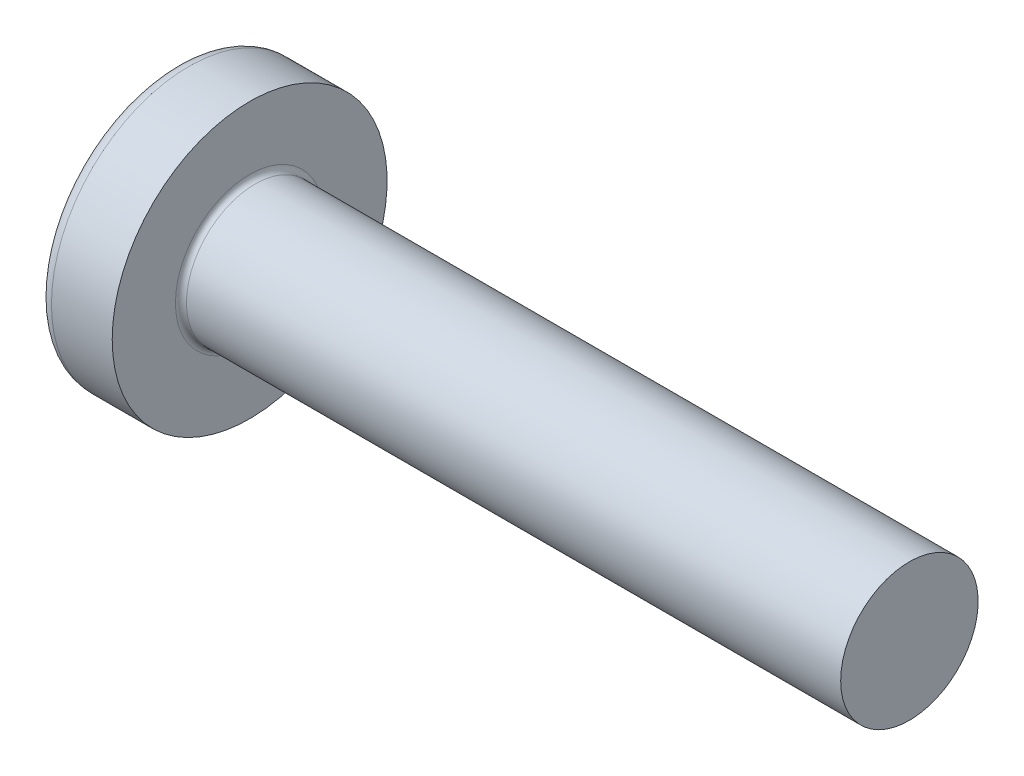
ISO-10303-21;
HEADER;
FILE_DESCRIPTION(('STEP AP214'),'2;1');
FILE_NAME('part.step','',(''),(''),'','','');
FILE_SCHEMA(('AUTOMOTIVE_DESIGN { 1 0 10303 214 1 1 1 1 }'));
ENDSEC;
DATA;
#1=APPLICATION_CONTEXT('core data for automotive mechanical design processes');
#2=APPLICATION_PROTOCOL_DEFINITION('international standard','automotive_design',2000,#1);
#3=PRODUCT_CONTEXT('',#1,'mechanical');
#4=PRODUCT('Part','Part','',(#3));
#5=PRODUCT_RELATED_PRODUCT_CATEGORY('part','',(#4));
#6=PRODUCT_DEFINITION_FORMATION('','',#4);
#7=PRODUCT_DEFINITION_CONTEXT('part definition',#1,'design');
#8=PRODUCT_DEFINITION('design','',#6,#7);
#9=PRODUCT_DEFINITION_SHAPE('','',#8);
#10=(LENGTH_UNIT() NAMED_UNIT(*) SI_UNIT(.MILLI.,.METRE.));
#11=(NAMED_UNIT(*) PLANE_ANGLE_UNIT() SI_UNIT($,.RADIAN.));
#12=(NAMED_UNIT(*) SI_UNIT($,.STERADIAN.) SOLID_ANGLE_UNIT());
#13=UNCERTAINTY_MEASURE_WITH_UNIT(LENGTH_MEASURE(1.E-05),#10,'distance_accuracy_value','');
#14=(GEOMETRIC_REPRESENTATION_CONTEXT(3) GLOBAL_UNCERTAINTY_ASSIGNED_CONTEXT((#13)) GLOBAL_UNIT_ASSIGNED_CONTEXT((#10,
#11,#12)) REPRESENTATION_CONTEXT('',''));
#15=CARTESIAN_POINT('',(0.,0.,0.));
#16=DIRECTION('',(0.,0.,1.));
#17=DIRECTION('',(1.,0.,0.));
#18=AXIS2_PLACEMENT_3D('',#15,#16,#17);
#19=CARTESIAN_POINT('',(4.,0.,0.));
#20=DIRECTION('',(-1.,0.,0.));
#21=DIRECTION('',(0.,1.,0.));
#22=AXIS2_PLACEMENT_3D('',#19,#20,#21);
#23=SPHERICAL_SURFACE('',#22,4.);
#24=CARTESIAN_POINT('',(0.803195914613461,0.,0.));
#25=DIRECTION('',(-1.,0.,0.));
#26=DIRECTION('',(0.,0.,1.));
#27=AXIS2_PLACEMENT_3D('',#24,#25,#26);
#28=CIRCLE('',#27,2.40425531914894);
#29=CARTESIAN_POINT('',(0.803195914613461,0.,2.40425531914889));
#30=VERTEX_POINT('',#29);
#31=EDGE_CURVE('E238',#30,#30,#28,.T.);
#32=ORIENTED_EDGE('',*,*,#31,.T.);
#33=EDGE_LOOP('',(#32));
#34=FACE_BOUND('',#33,.T.);
#35=CARTESIAN_POINT('',(0.0543400780062958,0.,0.));
#36=DIRECTION('',(1.,0.,0.));
#37=DIRECTION('',(0.,0.,-1.));
#38=AXIS2_PLACEMENT_3D('',#35,#36,#37);
#39=CIRCLE('',#38,0.657090389499513);
#40=CARTESIAN_POINT('',(0.0543400780062958,-0.369999999999954,-0.543017292517121));
#41=VERTEX_POINT('',#40);
#42=CARTESIAN_POINT('',(0.0543400780062958,-0.543017292517115,-0.370000000000002));
#43=VERTEX_POINT('',#42);
#44=EDGE_CURVE('E374',#41,#43,#39,.F.);
#45=ORIENTED_EDGE('',*,*,#44,.F.);
#46=CARTESIAN_POINT('',(4.,-0.370000000000023,0.));
#47=DIRECTION('',(0.,1.,0.));
#48=DIRECTION('',(0.,0.,1.));
#49=AXIS2_PLACEMENT_3D('',#46,#47,#48);
#50=CIRCLE('',#49,3.98285073785097);
#51=CARTESIAN_POINT('',(0.201999107564771,-0.369999999999995,-1.19928696360011));
#52=VERTEX_POINT('',#51);
#53=EDGE_CURVE('E300',#52,#41,#50,.T.);
#54=ORIENTED_EDGE('',*,*,#53,.F.);
#55=CARTESIAN_POINT('',(3.72274316107109,0.,0.556091207572086));
#56=DIRECTION('',(0.446197800778958,0.,-0.894934367749961));
#57=DIRECTION('',(-0.89493436774996,0.,-0.446197800778958));
#58=AXIS2_PLACEMENT_3D('',#55,#56,#57);
#59=CIRCLE('',#58,3.95144166275147);
#60=CARTESIAN_POINT('',(0.201999107564771,0.370000000000002,-1.19928696360015));
#61=VERTEX_POINT('',#60);
#62=EDGE_CURVE('E272',#52,#61,#59,.T.);
#63=ORIENTED_EDGE('',*,*,#62,.T.);
#64=CARTESIAN_POINT('',(4.,0.369999999999981,0.));
#65=DIRECTION('',(0.,-1.,0.));
#66=DIRECTION('',(0.,0.,-1.));
#67=AXIS2_PLACEMENT_3D('',#64,#65,#66);
#68=CIRCLE('',#67,3.98285073785097);
#69=CARTESIAN_POINT('',(0.0543400780062958,0.370000000000044,-0.543017292517156));
#70=VERTEX_POINT('',#69);
#71=EDGE_CURVE('E327',#70,#61,#68,.T.);
#72=ORIENTED_EDGE('',*,*,#71,.F.);
#73=CARTESIAN_POINT('',(0.0543400780062958,0.543017292517115,-0.370000000000044));
#74=VERTEX_POINT('',#73);
#75=EDGE_CURVE('E393',#74,#70,#39,.F.);
#76=ORIENTED_EDGE('',*,*,#75,.F.);
#77=CARTESIAN_POINT('',(4.,0.,-0.370000000000044));
#78=DIRECTION('',(0.,0.,1.));
#79=DIRECTION('',(1.,0.,0.));
#80=AXIS2_PLACEMENT_3D('',#77,#78,#79);
#81=CIRCLE('',#80,3.98285073785097);
#82=CARTESIAN_POINT('',(0.201999107564771,1.19928696360011,-0.370000000000002));
#83=VERTEX_POINT('',#82);
#84=EDGE_CURVE('E266',#83,#74,#81,.T.);
#85=ORIENTED_EDGE('',*,*,#84,.F.);
#86=CARTESIAN_POINT('',(3.72274316107109,-0.556091207572149,0.));
#87=DIRECTION('',(0.446197800778958,0.89493436774996,0.));
#88=DIRECTION('',(-0.89493436774996,0.446197800778958,0.));
#89=AXIS2_PLACEMENT_3D('',#86,#87,#88);
#90=CIRCLE('',#89,3.95144166275147);
#91=CARTESIAN_POINT('',(0.201999107564771,1.19928696360013,0.370000000000002));
#92=VERTEX_POINT('',#91);
#93=EDGE_CURVE('E269',#83,#92,#90,.T.);
#94=ORIENTED_EDGE('',*,*,#93,.T.);
#95=CARTESIAN_POINT('',(4.,0.,0.369999999999961));
#96=DIRECTION('',(0.,0.,-1.));
#97=DIRECTION('',(0.,1.,0.));
#98=AXIS2_PLACEMENT_3D('',#95,#96,#97);
#99=CIRCLE('',#98,3.98285073785097);
#100=CARTESIAN_POINT('',(0.0543400780062958,0.543017292517135,0.369999999999961));
#101=VERTEX_POINT('',#100);
#102=EDGE_CURVE('E262',#101,#92,#99,.T.);
#103=ORIENTED_EDGE('',*,*,#102,.F.);
#104=CARTESIAN_POINT('',(0.0543400780062958,0.369999999999995,0.54301729251708));
#105=VERTEX_POINT('',#104);
#106=EDGE_CURVE('E392',#105,#101,#39,.F.);
#107=ORIENTED_EDGE('',*,*,#106,.F.);
#108=CARTESIAN_POINT('',(0.201999107564771,0.370000000000016,1.19928696360008));
#109=VERTEX_POINT('',#108);
#110=EDGE_CURVE('E282',#109,#105,#68,.T.);
#111=ORIENTED_EDGE('',*,*,#110,.F.);
#112=CARTESIAN_POINT('',(3.72274316107109,0.,-0.556091207572169));
#113=DIRECTION('',(0.446197800778958,0.,0.89493436774996));
#114=DIRECTION('',(0.89493436774996,0.,-0.446197800778958));
#115=AXIS2_PLACEMENT_3D('',#112,#113,#114);
#116=CIRCLE('',#115,3.95144166275147);
#117=CARTESIAN_POINT('',(0.201999107564771,-0.369999999999981,1.19928696360011));
#118=VERTEX_POINT('',#117);
#119=EDGE_CURVE('E49',#109,#118,#116,.T.);
#120=ORIENTED_EDGE('',*,*,#119,.T.);
#121=CARTESIAN_POINT('',(0.0543400780062958,-0.370000000000002,0.543017292517115));
#122=VERTEX_POINT('',#121);
#123=EDGE_CURVE('E279',#122,#118,#50,.T.);
#124=ORIENTED_EDGE('',*,*,#123,.F.);
#125=CARTESIAN_POINT('',(0.0543400780062958,-0.543017292517094,0.370000000000002));
#126=VERTEX_POINT('',#125);
#127=EDGE_CURVE('E428',#126,#122,#39,.F.);
#128=ORIENTED_EDGE('',*,*,#127,.F.);
#129=CARTESIAN_POINT('',(0.201999107564771,-1.19928696360007,0.369999999999961));
#130=VERTEX_POINT('',#129);
#131=EDGE_CURVE('E263',#130,#126,#99,.T.);
#132=ORIENTED_EDGE('',*,*,#131,.F.);
#133=CARTESIAN_POINT('',(3.72274316107109,0.556091207572107,0.));
#134=DIRECTION('',(0.446197800778958,-0.894934367749961,0.));
#135=DIRECTION('',(0.89493436774996,0.446197800778958,0.));
#136=AXIS2_PLACEMENT_3D('',#133,#134,#135);
#137=CIRCLE('',#136,3.95144166275147);
#138=CARTESIAN_POINT('',(0.201999107564771,-1.19928696360011,-0.370000000000044));
#139=VERTEX_POINT('',#138);
#140=EDGE_CURVE('E259',#130,#139,#137,.T.);
#141=ORIENTED_EDGE('',*,*,#140,.T.);
#142=EDGE_CURVE('E64',#43,#139,#81,.T.);
#143=ORIENTED_EDGE('',*,*,#142,.F.);
#144=EDGE_LOOP('',(#45,#54,#63,#72,#76,#85,#94,#103,#107,#111,#120,#124,#128,#132,#141,#143));
#145=FACE_BOUND('',#144,.T.);
#146=ADVANCED_FACE('F36',(#34,#145),#23,.T.);
#147=CARTESIAN_POINT('',(1.5,0.552127613725223,-0.370000000000044));
#148=DIRECTION('',(0.,0.,1.));
#149=DIRECTION('',(1.,0.,0.));
#150=AXIS2_PLACEMENT_3D('',#147,#148,#149);
#151=PLANE('',#150);
#152=ORIENTED_EDGE('',*,*,#84,.T.);
#153=CARTESIAN_POINT('',(-0.984107487668667,0.628943903399945,-0.370000000000044));
#154=CARTESIAN_POINT('',(-0.783603343008974,0.612669947295709,-0.370000000000044));
#155=CARTESIAN_POINT('',(-0.583110931104087,0.596248129681112,-0.370000000000044));
#156=CARTESIAN_POINT('',(-0.18215578845211,0.562989164841699,-0.370000000000044));
#157=CARTESIAN_POINT('',(0.0183069414735524,0.546152007726028,-0.370000000000044));
#158=CARTESIAN_POINT('',(0.419186928470487,0.511943523152248,-0.370000000000044));
#159=CARTESIAN_POINT('',(0.61960418554543,0.494572195737289,-0.370000000000044));
#160=CARTESIAN_POINT('',(1.02037173794706,0.459102589125867,-0.370000000000044));
#161=CARTESIAN_POINT('',(1.22072203423871,0.441004320904914,-0.370000000000044));
#162=CARTESIAN_POINT('',(1.53631168775259,0.411665443099231,-0.370000000000044));
#163=CARTESIAN_POINT('',(1.65158348734209,0.400774467003812,-0.370000000000044));
#164=CARTESIAN_POINT('',(1.88208360561816,0.378547148307999,-0.370000000000044));
#165=CARTESIAN_POINT('',(1.99731192452822,0.367210808029304,-0.370000000000044));
#166=CARTESIAN_POINT('',(2.22771614129237,0.343963614894699,-0.370000000000044));
#167=CARTESIAN_POINT('',(2.34289203669079,0.332052737461366,-0.370000000000044));
#168=CARTESIAN_POINT('',(2.5731581934851,0.30741320876735,-0.370000000000044));
#169=CARTESIAN_POINT('',(2.68824845325022,0.294684542317189,-0.370000000000044));
#170=CARTESIAN_POINT('',(2.80327961663798,0.281425340988552,-0.370000000000044));
#171=B_SPLINE_CURVE_WITH_KNOTS('',3,(#153,#154,#155,#156,#157,#158,#159,#160,#161,#162,#163,
#164,#165,#166,#167,#168,#169,#170),.UNSPECIFIED.,.F.,.F.,(4,2,2,2,2,2,2,2,4),(0.,
0.603490856265066,1.20699609790343,1.81050129079257,2.41399737525255,2.7613521432415,
3.1087051006963,3.45607293033825,3.80344721379854),.UNSPECIFIED.);
#172=CARTESIAN_POINT('',(1.5,0.415013252800397,-0.370000000000044));
#173=VERTEX_POINT('',#172);
#174=EDGE_CURVE('E414',#74,#173,#171,.T.);
#175=ORIENTED_EDGE('',*,*,#174,.T.);
#176=DIRECTION('',(0.,1.,0.));
#177=VECTOR('',#176,1.);
#178=CARTESIAN_POINT('',(1.5,-0.552127613725306,-0.370000000000002));
#179=LINE('',#178,#177);
#180=CARTESIAN_POINT('',(1.5,0.552127613725223,-0.370000000000044));
#181=VERTEX_POINT('',#180);
#182=EDGE_CURVE('E356',#173,#181,#179,.T.);
#183=ORIENTED_EDGE('',*,*,#182,.T.);
#184=DIRECTION('',(0.89493436774996,-0.446197800778958,0.));
#185=VECTOR('',#184,1.);
#186=CARTESIAN_POINT('',(0.,1.3,-0.370000000000002));
#187=LINE('',#186,#185);
#188=EDGE_CURVE('E239',#83,#181,#187,.T.);
#189=ORIENTED_EDGE('',*,*,#188,.F.);
#190=EDGE_LOOP('',(#152,#175,#183,#189));
#191=FACE_BOUND('',#190,.T.);
#192=ADVANCED_FACE('F194',(#191),#151,.T.);
#193=CARTESIAN_POINT('',(1.5,-0.552127613725306,-0.370000000000002));
#194=VERTEX_POINT('',#193);
#195=CARTESIAN_POINT('',(1.5,-0.415013252800481,-0.370000000000002));
#196=VERTEX_POINT('',#195);
#197=EDGE_CURVE('E247',#194,#196,#179,.T.);
#198=ORIENTED_EDGE('',*,*,#197,.T.);
#199=CARTESIAN_POINT('',(-0.984107487668667,-0.628943903399945,-0.370000000000002));
#200=CARTESIAN_POINT('',(-0.78360334300897,-0.612669947295761,-0.370000000000063));
#201=CARTESIAN_POINT('',(-0.583110931104083,-0.596248129681166,-0.37000000000006));
#202=CARTESIAN_POINT('',(-0.182155788452108,-0.562989164841729,-0.370000000000027));
#203=CARTESIAN_POINT('',(0.0183069414735527,-0.546152007726031,-0.369999999999997));
#204=CARTESIAN_POINT('',(0.419186928470485,-0.511943523152245,-0.370000000000007));
#205=CARTESIAN_POINT('',(0.619604185545429,-0.494572195737305,-0.370000000000048));
#206=CARTESIAN_POINT('',(1.02037173794706,-0.459102589125934,-0.37000000000004));
#207=CARTESIAN_POINT('',(1.22072203423871,-0.441004320905012,-0.369999999999991));
#208=CARTESIAN_POINT('',(1.53631168775259,-0.411665443099305,-0.370000000000009));
#209=CARTESIAN_POINT('',(1.65158348734209,-0.400774467003864,-0.370000000000035));
#210=CARTESIAN_POINT('',(1.88208360561815,-0.378547148308031,-0.370000000000053));
#211=CARTESIAN_POINT('',(1.99731192452822,-0.367210808029342,-0.370000000000046));
#212=CARTESIAN_POINT('',(2.22771614129238,-0.343963614894743,-0.370000000000042));
#213=CARTESIAN_POINT('',(2.34289203669079,-0.332052737461413,-0.370000000000047));
#214=CARTESIAN_POINT('',(2.5731581934851,-0.307413208767386,-0.370000000000041));
#215=CARTESIAN_POINT('',(2.68824845325022,-0.294684542317213,-0.370000000000032));
#216=CARTESIAN_POINT('',(2.80327961663798,-0.281425340988552,-0.370000000000002));
#217=B_SPLINE_CURVE_WITH_KNOTS('',3,(#199,#200,#201,#202,#203,#204,#205,#206,#207,#208,#209,
#210,#211,#212,#213,#214,#215,#216),.UNSPECIFIED.,.F.,.F.,(4,2,2,2,2,2,2,2,4),(0.,
0.603490856265066,1.20699609790343,1.81050129079257,2.41399737525255,2.7613521432415,
3.1087051006963,3.45607293033825,3.80344721379854),.UNSPECIFIED.);
#218=EDGE_CURVE('E391',#196,#43,#217,.F.);
#219=ORIENTED_EDGE('',*,*,#218,.T.);
#220=ORIENTED_EDGE('',*,*,#142,.T.);
#221=DIRECTION('',(0.89493436774996,0.446197800778958,0.));
#222=VECTOR('',#221,1.);
#223=CARTESIAN_POINT('',(0.,-1.3,-0.370000000000044));
#224=LINE('',#223,#222);
#225=EDGE_CURVE('E330',#139,#194,#224,.T.);
#226=ORIENTED_EDGE('',*,*,#225,.T.);
#227=EDGE_LOOP('',(#198,#219,#220,#226));
#228=FACE_BOUND('',#227,.T.);
#229=ADVANCED_FACE('F200',(#228),#151,.T.);
#230=CARTESIAN_POINT('',(1.5,-0.552127613725285,0.370000000000002));
#231=DIRECTION('',(0.,0.,-1.));
#232=DIRECTION('',(0.,1.,0.));
#233=AXIS2_PLACEMENT_3D('',#230,#231,#232);
#234=PLANE('',#233);
#235=DIRECTION('',(0.,-1.,0.));
#236=VECTOR('',#235,1.);
#237=CARTESIAN_POINT('',(1.5,0.552127613725244,0.369999999999961));
#238=LINE('',#237,#236);
#239=CARTESIAN_POINT('',(1.5,0.552127613725244,0.369999999999961));
#240=VERTEX_POINT('',#239);
#241=CARTESIAN_POINT('',(1.5,0.415013252800418,0.369999999999961));
#242=VERTEX_POINT('',#241);
#243=EDGE_CURVE('E339',#240,#242,#238,.T.);
#244=ORIENTED_EDGE('',*,*,#243,.T.);
#245=CARTESIAN_POINT('',(-0.984107487668667,0.628943903399966,0.369999999999961));
#246=CARTESIAN_POINT('',(-0.78360334300898,0.612669947295659,0.370000000000021));
#247=CARTESIAN_POINT('',(-0.583110931104093,0.596248129681067,0.370000000000019));
#248=CARTESIAN_POINT('',(-0.182155788452112,0.562989164841693,0.369999999999986));
#249=CARTESIAN_POINT('',(0.0183069414735532,0.546152007726057,0.369999999999955));
#250=CARTESIAN_POINT('',(0.419186928470486,0.511943523152261,0.369999999999966));
#251=CARTESIAN_POINT('',(0.619604185545425,0.49457219573725,0.370000000000006));
#252=CARTESIAN_POINT('',(1.02037173794705,0.459102589125841,0.369999999999998));
#253=CARTESIAN_POINT('',(1.22072203423871,0.441004320904952,0.36999999999995));
#254=CARTESIAN_POINT('',(1.53631168775259,0.411665443099242,0.369999999999967));
#255=CARTESIAN_POINT('',(1.65158348734209,0.400774467003787,0.369999999999993));
#256=CARTESIAN_POINT('',(1.88208360561815,0.378547148307946,0.370000000000012));
#257=CARTESIAN_POINT('',(1.99731192452821,0.36721080802926,0.370000000000004));
#258=CARTESIAN_POINT('',(2.22771614129237,0.343963614894657,0.370000000000001));
#259=CARTESIAN_POINT('',(2.34289203669078,0.332052737461319,0.370000000000005));
#260=CARTESIAN_POINT('',(2.57315819348509,0.307413208767301,0.37));
#261=CARTESIAN_POINT('',(2.68824845325022,0.294684542317145,0.36999999999999));
#262=CARTESIAN_POINT('',(2.80327961663798,0.281425340988531,0.369999999999961));
#263=B_SPLINE_CURVE_WITH_KNOTS('',3,(#245,#246,#247,#248,#249,#250,#251,#252,#253,#254,#255,
#256,#257,#258,#259,#260,#261,#262),.UNSPECIFIED.,.F.,.F.,(4,2,2,2,2,2,2,2,4),(0.,
0.603490856265066,1.20699609790343,1.81050129079257,2.41399737525255,2.7613521432415,
3.1087051006963,3.45607293033825,3.80344721379854),.UNSPECIFIED.);
#264=EDGE_CURVE('E612',#242,#101,#263,.F.);
#265=ORIENTED_EDGE('',*,*,#264,.T.);
#266=ORIENTED_EDGE('',*,*,#102,.T.);
#267=DIRECTION('',(0.89493436774996,-0.446197800778958,0.));
#268=VECTOR('',#267,1.);
#269=CARTESIAN_POINT('',(0.,1.30000000000002,0.370000000000002));
#270=LINE('',#269,#268);
#271=EDGE_CURVE('E244',#92,#240,#270,.T.);
#272=ORIENTED_EDGE('',*,*,#271,.T.);
#273=EDGE_LOOP('',(#244,#265,#266,#272));
#274=FACE_BOUND('',#273,.T.);
#275=ADVANCED_FACE('F410',(#274),#234,.T.);
#276=ORIENTED_EDGE('',*,*,#131,.T.);
#277=CARTESIAN_POINT('',(-0.984107487668667,-0.628943903399924,0.370000000000002));
#278=CARTESIAN_POINT('',(-0.783603343008972,-0.61266994729573,0.370000000000002));
#279=CARTESIAN_POINT('',(-0.583110931104084,-0.596248129681136,0.370000000000002));
#280=CARTESIAN_POINT('',(-0.182155788452108,-0.562989164841705,0.370000000000002));
#281=CARTESIAN_POINT('',(0.018306941473553,-0.546152007726013,0.370000000000002));
#282=CARTESIAN_POINT('',(0.419186928470485,-0.511943523152221,0.370000000000002));
#283=CARTESIAN_POINT('',(0.619604185545428,-0.49457219573727,0.370000000000002));
#284=CARTESIAN_POINT('',(1.02037173794706,-0.459102589125904,0.370000000000002));
#285=CARTESIAN_POINT('',(1.22072203423871,-0.441004320904998,0.370000000000002));
#286=CARTESIAN_POINT('',(1.53631168775259,-0.411665443099281,0.370000000000002));
#287=CARTESIAN_POINT('',(1.65158348734209,-0.400774467003828,0.370000000000002));
#288=CARTESIAN_POINT('',(1.88208360561815,-0.378547148307988,0.370000000000002));
#289=CARTESIAN_POINT('',(1.99731192452821,-0.367210808029302,0.370000000000002));
#290=CARTESIAN_POINT('',(2.22771614129237,-0.343963614894698,0.370000000000002));
#291=CARTESIAN_POINT('',(2.34289203669078,-0.33205273746136,0.370000000000002));
#292=CARTESIAN_POINT('',(2.57315819348509,-0.307413208767343,0.370000000000002));
#293=CARTESIAN_POINT('',(2.68824845325022,-0.294684542317187,0.370000000000002));
#294=CARTESIAN_POINT('',(2.80327961663798,-0.281425340988573,0.370000000000002));
#295=B_SPLINE_CURVE_WITH_KNOTS('',3,(#277,#278,#279,#280,#281,#282,#283,#284,#285,#286,#287,
#288,#289,#290,#291,#292,#293,#294),.UNSPECIFIED.,.F.,.F.,(4,2,2,2,2,2,2,2,4),(0.,
0.603490856265066,1.20699609790343,1.81050129079257,2.41399737525255,2.7613521432415,
3.10870510069629,3.45607293033825,3.80344721379854),.UNSPECIFIED.);
#296=CARTESIAN_POINT('',(1.5,-0.41501325280046,0.370000000000002));
#297=VERTEX_POINT('',#296);
#298=EDGE_CURVE('E429',#126,#297,#295,.T.);
#299=ORIENTED_EDGE('',*,*,#298,.T.);
#300=CARTESIAN_POINT('',(1.5,-0.552127613725285,0.370000000000002));
#301=VERTEX_POINT('',#300);
#302=EDGE_CURVE('E341',#297,#301,#238,.T.);
#303=ORIENTED_EDGE('',*,*,#302,.T.);
#304=DIRECTION('',(0.89493436774996,0.446197800778958,0.));
#305=VECTOR('',#304,1.);
#306=CARTESIAN_POINT('',(0.,-1.29999999999996,0.369999999999961));
#307=LINE('',#306,#305);
#308=EDGE_CURVE('E332',#130,#301,#307,.T.);
#309=ORIENTED_EDGE('',*,*,#308,.F.);
#310=EDGE_LOOP('',(#276,#299,#303,#309));
#311=FACE_BOUND('',#310,.T.);
#312=ADVANCED_FACE('F528',(#311),#234,.T.);
#313=CARTESIAN_POINT('',(1.5,0.552127613725244,0.369999999999961));
#314=DIRECTION('',(0.446197800778958,0.89493436774996,0.));
#315=DIRECTION('',(-0.89493436774996,0.446197800778958,0.));
#316=AXIS2_PLACEMENT_3D('',#313,#314,#315);
#317=PLANE('',#316);
#318=CARTESIAN_POINT('',(2.47007520981164,0.068465972373373,0.));
#319=DIRECTION('',(0.446197800778958,0.89493436774996,0.));
#320=DIRECTION('',(-0.89493436774996,0.446197800778958,0.));
#321=AXIS2_PLACEMENT_3D('',#318,#319,#320);
#322=ELLIPSE('',#321,1.09405678911959,0.483340660124242);
#323=CARTESIAN_POINT('',(1.5,0.552127613725244,0.0655064741994296));
#324=VERTEX_POINT('',#323);
#325=CARTESIAN_POINT('',(1.5,0.552127613725244,-0.0655064741995129));
#326=VERTEX_POINT('',#325);
#327=EDGE_CURVE('E305',#324,#326,#322,.F.);
#328=ORIENTED_EDGE('',*,*,#327,.F.);
#329=DIRECTION('',(0.,0.,-1.));
#330=VECTOR('',#329,1.);
#331=CARTESIAN_POINT('',(1.5,0.552127613725244,0.369999999999961));
#332=LINE('',#331,#330);
#333=EDGE_CURVE('E342',#240,#324,#332,.T.);
#334=ORIENTED_EDGE('',*,*,#333,.F.);
#335=ORIENTED_EDGE('',*,*,#271,.F.);
#336=ORIENTED_EDGE('',*,*,#93,.F.);
#337=ORIENTED_EDGE('',*,*,#188,.T.);
#338=EDGE_CURVE('E344',#326,#181,#332,.T.);
#339=ORIENTED_EDGE('',*,*,#338,.F.);
#340=EDGE_LOOP('',(#328,#334,#335,#336,#337,#339));
#341=FACE_BOUND('',#340,.T.);
#342=ADVANCED_FACE('F408',(#341),#317,.F.);
#343=CARTESIAN_POINT('',(0.,-1.3,-0.370000000000044));
#344=DIRECTION('',(0.446197800778958,-0.894934367749961,0.));
#345=DIRECTION('',(0.89493436774996,0.446197800778958,0.));
#346=AXIS2_PLACEMENT_3D('',#343,#344,#345);
#347=PLANE('',#346);
#348=CARTESIAN_POINT('',(2.47007520981164,-0.0684659723734146,0.));
#349=DIRECTION('',(0.446197800778958,-0.894934367749961,0.));
#350=DIRECTION('',(-0.89493436774996,-0.446197800778958,0.));
#351=AXIS2_PLACEMENT_3D('',#348,#349,#350);
#352=ELLIPSE('',#351,1.09405678911959,0.483340660124243);
#353=CARTESIAN_POINT('',(1.5,-0.552127613725285,-0.0655064741994713));
#354=VERTEX_POINT('',#353);
#355=CARTESIAN_POINT('',(1.5,-0.552127613725285,0.0655064741994713));
#356=VERTEX_POINT('',#355);
#357=EDGE_CURVE('E614',#354,#356,#352,.F.);
#358=ORIENTED_EDGE('',*,*,#357,.F.);
#359=DIRECTION('',(0.,0.,1.));
#360=VECTOR('',#359,1.);
#361=CARTESIAN_POINT('',(1.5,-0.552127613725306,-0.370000000000002));
#362=LINE('',#361,#360);
#363=EDGE_CURVE('E335',#194,#354,#362,.T.);
#364=ORIENTED_EDGE('',*,*,#363,.F.);
#365=ORIENTED_EDGE('',*,*,#225,.F.);
#366=ORIENTED_EDGE('',*,*,#140,.F.);
#367=ORIENTED_EDGE('',*,*,#308,.T.);
#368=EDGE_CURVE('E338',#356,#301,#362,.T.);
#369=ORIENTED_EDGE('',*,*,#368,.F.);
#370=EDGE_LOOP('',(#358,#364,#365,#366,#367,#369));
#371=FACE_BOUND('',#370,.T.);
#372=ADVANCED_FACE('F515',(#371),#347,.F.);
#373=CARTESIAN_POINT('',(1.5,0.552127613725223,-0.370000000000044));
#374=DIRECTION('',(-1.,0.,0.));
#375=DIRECTION('',(0.,0.,1.));
#376=AXIS2_PLACEMENT_3D('',#373,#374,#375);
#377=PLANE('',#376);
#378=DIRECTION('',(0.,1.,0.));
#379=VECTOR('',#378,1.);
#380=CARTESIAN_POINT('',(1.5,-0.370000000000002,0.552127613725258));
#381=LINE('',#380,#379);
#382=CARTESIAN_POINT('',(1.5,-0.370000000000002,0.552127613725258));
#383=VERTEX_POINT('',#382);
#384=CARTESIAN_POINT('',(1.5,-0.0655064741994851,0.552127613725223));
#385=VERTEX_POINT('',#384);
#386=EDGE_CURVE('E320',#383,#385,#381,.T.);
#387=ORIENTED_EDGE('',*,*,#386,.T.);
#388=CARTESIAN_POINT('',(1.5,0.,0.));
#389=DIRECTION('',(-1.,0.,0.));
#390=DIRECTION('',(0.,0.,1.));
#391=AXIS2_PLACEMENT_3D('',#388,#389,#390);
#392=CIRCLE('',#391,0.556);
#393=CARTESIAN_POINT('',(1.5,-0.370000000000023,0.415013252800439));
#394=VERTEX_POINT('',#393);
#395=EDGE_CURVE('E640',#394,#385,#392,.T.);
#396=ORIENTED_EDGE('',*,*,#395,.F.);
#397=DIRECTION('',(0.,0.,-1.));
#398=VECTOR('',#397,1.);
#399=CARTESIAN_POINT('',(1.5,-0.370000000000002,0.552127613725258));
#400=LINE('',#399,#398);
#401=EDGE_CURVE('E316',#383,#394,#400,.T.);
#402=ORIENTED_EDGE('',*,*,#401,.F.);
#403=EDGE_LOOP('',(#387,#396,#402));
#404=FACE_BOUND('',#403,.T.);
#405=ADVANCED_FACE('F465',(#404),#377,.T.);
#406=ORIENTED_EDGE('',*,*,#302,.F.);
#407=EDGE_CURVE('E645',#356,#297,#392,.T.);
#408=ORIENTED_EDGE('',*,*,#407,.F.);
#409=ORIENTED_EDGE('',*,*,#368,.T.);
#410=EDGE_LOOP('',(#406,#408,#409));
#411=FACE_BOUND('',#410,.T.);
#412=ADVANCED_FACE('F500',(#411),#377,.T.);
#413=ORIENTED_EDGE('',*,*,#363,.T.);
#414=EDGE_CURVE('E385',#196,#354,#392,.T.);
#415=ORIENTED_EDGE('',*,*,#414,.F.);
#416=ORIENTED_EDGE('',*,*,#197,.F.);
#417=EDGE_LOOP('',(#413,#415,#416));
#418=FACE_BOUND('',#417,.T.);
#419=ADVANCED_FACE('F493',(#418),#377,.T.);
#420=CARTESIAN_POINT('',(1.5,-0.369999999999995,-0.415013252800439));
#421=VERTEX_POINT('',#420);
#422=CARTESIAN_POINT('',(1.5,-0.369999999999995,-0.552127613725265));
#423=VERTEX_POINT('',#422);
#424=EDGE_CURVE('E319',#421,#423,#400,.T.);
#425=ORIENTED_EDGE('',*,*,#424,.F.);
#426=CARTESIAN_POINT('',(1.5,-0.0655064741994851,-0.552127613725306));
#427=VERTEX_POINT('',#426);
#428=EDGE_CURVE('E56',#427,#421,#392,.T.);
#429=ORIENTED_EDGE('',*,*,#428,.F.);
#430=DIRECTION('',(0.,-1.,0.));
#431=VECTOR('',#430,1.);
#432=CARTESIAN_POINT('',(1.5,0.370000000000002,-0.552127613725299));
#433=LINE('',#432,#431);
#434=EDGE_CURVE('E315',#427,#423,#433,.T.);
#435=ORIENTED_EDGE('',*,*,#434,.T.);
#436=EDGE_LOOP('',(#425,#429,#435));
#437=FACE_BOUND('',#436,.T.);
#438=ADVANCED_FACE('F380',(#437),#377,.T.);
#439=CARTESIAN_POINT('',(1.5,0.370000000000002,-0.552127613725299));
#440=VERTEX_POINT('',#439);
#441=CARTESIAN_POINT('',(1.5,0.0655064741994921,-0.552127613725306));
#442=VERTEX_POINT('',#441);
#443=EDGE_CURVE('E312',#440,#442,#433,.T.);
#444=ORIENTED_EDGE('',*,*,#443,.T.);
#445=CARTESIAN_POINT('',(1.5,0.370000000000002,-0.415013252800481));
#446=VERTEX_POINT('',#445);
#447=EDGE_CURVE('E384',#446,#442,#392,.T.);
#448=ORIENTED_EDGE('',*,*,#447,.F.);
#449=DIRECTION('',(0.,0.,1.));
#450=VECTOR('',#449,1.);
#451=CARTESIAN_POINT('',(1.5,0.370000000000002,-0.552127613725299));
#452=LINE('',#451,#450);
#453=EDGE_CURVE('E324',#440,#446,#452,.T.);
#454=ORIENTED_EDGE('',*,*,#453,.F.);
#455=EDGE_LOOP('',(#444,#448,#454));
#456=FACE_BOUND('',#455,.T.);
#457=ADVANCED_FACE('F479',(#456),#377,.T.);
#458=ORIENTED_EDGE('',*,*,#182,.F.);
#459=EDGE_CURVE('E629',#326,#173,#392,.T.);
#460=ORIENTED_EDGE('',*,*,#459,.F.);
#461=ORIENTED_EDGE('',*,*,#338,.T.);
#462=EDGE_LOOP('',(#458,#460,#461));
#463=FACE_BOUND('',#462,.T.);
#464=ADVANCED_FACE('F472',(#463),#377,.T.);
#465=ORIENTED_EDGE('',*,*,#333,.T.);
#466=EDGE_CURVE('E631',#242,#324,#392,.T.);
#467=ORIENTED_EDGE('',*,*,#466,.F.);
#468=ORIENTED_EDGE('',*,*,#243,.F.);
#469=EDGE_LOOP('',(#465,#467,#468));
#470=FACE_BOUND('',#469,.T.);
#471=ADVANCED_FACE('F463',(#470),#377,.T.);
#472=CARTESIAN_POINT('',(1.5,0.369999999999975,0.415013252800397));
#473=VERTEX_POINT('',#472);
#474=CARTESIAN_POINT('',(1.5,0.369999999999995,0.552127613725223));
#475=VERTEX_POINT('',#474);
#476=EDGE_CURVE('E297',#473,#475,#452,.T.);
#477=ORIENTED_EDGE('',*,*,#476,.F.);
#478=CARTESIAN_POINT('',(1.5,0.0655064741994851,0.552127613725223));
#479=VERTEX_POINT('',#478);
#480=EDGE_CURVE('E386',#479,#473,#392,.T.);
#481=ORIENTED_EDGE('',*,*,#480,.F.);
#482=EDGE_CURVE('E323',#479,#475,#381,.T.);
#483=ORIENTED_EDGE('',*,*,#482,.T.);
#484=EDGE_LOOP('',(#477,#481,#483));
#485=FACE_BOUND('',#484,.T.);
#486=ADVANCED_FACE('F456',(#485),#377,.T.);
#487=CARTESIAN_POINT('',(1.5,0.369999999999995,0.552127613725223));
#488=DIRECTION('',(0.,-1.,0.));
#489=DIRECTION('',(1.,0.,0.));
#490=AXIS2_PLACEMENT_3D('',#487,#488,#489);
#491=PLANE('',#490);
#492=ORIENTED_EDGE('',*,*,#110,.T.);
#493=CARTESIAN_POINT('',(-0.984107487668667,0.369999999999995,0.628943903399903));
#494=CARTESIAN_POINT('',(-0.783603343008973,0.369999999999995,0.61266994729568));
#495=CARTESIAN_POINT('',(-0.583110931104086,0.369999999999995,0.596248129681085));
#496=CARTESIAN_POINT('',(-0.182155788452109,0.369999999999995,0.562989164841667));
#497=CARTESIAN_POINT('',(0.0183069414735529,0.369999999999995,0.54615200772599));
#498=CARTESIAN_POINT('',(0.419186928470486,0.369999999999995,0.511943523152203));
#499=CARTESIAN_POINT('',(0.619604185545429,0.369999999999996,0.494572195737243));
#500=CARTESIAN_POINT('',(1.02037173794706,0.369999999999995,0.459102589125849));
#501=CARTESIAN_POINT('',(1.22072203423871,0.369999999999995,0.441004320904926));
#502=CARTESIAN_POINT('',(1.53631168775259,0.369999999999995,0.411665443099224));
#503=CARTESIAN_POINT('',(1.65158348734209,0.369999999999996,0.400774467003786));
#504=CARTESIAN_POINT('',(1.88208360561815,0.369999999999996,0.378547148307956));
#505=CARTESIAN_POINT('',(1.99731192452822,0.369999999999996,0.367210808029267));
#506=CARTESIAN_POINT('',(2.22771614129237,0.369999999999996,0.343963614894664));
#507=CARTESIAN_POINT('',(2.34289203669079,0.369999999999997,0.33205273746133));
#508=CARTESIAN_POINT('',(2.5731581934851,0.369999999999995,0.30741320876731));
#509=CARTESIAN_POINT('',(2.68824845325022,0.369999999999991,0.294684542317147));
#510=CARTESIAN_POINT('',(2.80327961663798,0.369999999999981,0.28142534098851));
#511=B_SPLINE_CURVE_WITH_KNOTS('',3,(#493,#494,#495,#496,#497,#498,#499,#500,#501,#502,#503,
#504,#505,#506,#507,#508,#509,#510),.UNSPECIFIED.,.F.,.F.,(4,2,2,2,2,2,2,2,4),(0.,
0.603490856265066,1.20699609790343,1.81050129079257,2.41399737525255,2.7613521432415,
3.1087051006963,3.45607293033825,3.80344721379854),.UNSPECIFIED.);
#512=EDGE_CURVE('E611',#105,#473,#511,.T.);
#513=ORIENTED_EDGE('',*,*,#512,.T.);
#514=ORIENTED_EDGE('',*,*,#476,.T.);
#515=DIRECTION('',(0.89493436774996,0.,-0.446197800778958));
#516=VECTOR('',#515,1.);
#517=CARTESIAN_POINT('',(0.,0.370000000000016,1.29999999999996));
#518=LINE('',#517,#516);
#519=EDGE_CURVE('E290',#109,#475,#518,.T.);
#520=ORIENTED_EDGE('',*,*,#519,.F.);
#521=EDGE_LOOP('',(#492,#513,#514,#520));
#522=FACE_BOUND('',#521,.T.);
#523=ADVANCED_FACE('F294',(#522),#491,.T.);
#524=CARTESIAN_POINT('',(1.5,-0.369999999999995,-0.552127613725265));
#525=DIRECTION('',(0.,1.,0.));
#526=DIRECTION('',(0.,0.,1.));
#527=AXIS2_PLACEMENT_3D('',#524,#525,#526);
#528=PLANE('',#527);
#529=ORIENTED_EDGE('',*,*,#401,.T.);
#530=CARTESIAN_POINT('',(-0.984107487668667,-0.370000000000002,0.628943903399938));
#531=CARTESIAN_POINT('',(-0.783603343008975,-0.369999999999998,0.612669947295696));
#532=CARTESIAN_POINT('',(-0.583110931104088,-0.369999999999998,0.596248129681103));
#533=CARTESIAN_POINT('',(-0.18215578845211,-0.370000000000001,0.562989164841698));
#534=CARTESIAN_POINT('',(0.0183069414735527,-0.370000000000003,0.546152007726031));
#535=CARTESIAN_POINT('',(0.419186928470486,-0.370000000000002,0.511943523152245));
#536=CARTESIAN_POINT('',(0.619604185545428,-0.369999999999999,0.494572195737275));
#537=CARTESIAN_POINT('',(1.02037173794706,-0.369999999999999,0.459102589125877));
#538=CARTESIAN_POINT('',(1.22072203423871,-0.370000000000003,0.441004320904958));
#539=CARTESIAN_POINT('',(1.53631168775259,-0.370000000000002,0.41166544309926));
#540=CARTESIAN_POINT('',(1.65158348734209,-0.369999999999999,0.400774467003822));
#541=CARTESIAN_POINT('',(1.88208360561815,-0.369999999999998,0.378547148307994));
#542=CARTESIAN_POINT('',(1.99731192452822,-0.369999999999999,0.367210808029306));
#543=CARTESIAN_POINT('',(2.22771614129237,-0.369999999999998,0.343963614894707));
#544=CARTESIAN_POINT('',(2.34289203669079,-0.369999999999996,0.332052737461375));
#545=CARTESIAN_POINT('',(2.5731581934851,-0.370000000000001,0.307413208767356));
#546=CARTESIAN_POINT('',(2.68824845325022,-0.370000000000007,0.294684542317193));
#547=CARTESIAN_POINT('',(2.80327961663798,-0.370000000000023,0.281425340988552));
#548=B_SPLINE_CURVE_WITH_KNOTS('',3,(#530,#531,#532,#533,#534,#535,#536,#537,#538,#539,#540,
#541,#542,#543,#544,#545,#546,#547),.UNSPECIFIED.,.F.,.F.,(4,2,2,2,2,2,2,2,4),(0.,
0.603490856265066,1.20699609790343,1.81050129079257,2.41399737525255,2.7613521432415,
3.1087051006963,3.45607293033825,3.80344721379854),.UNSPECIFIED.);
#549=EDGE_CURVE('E422',#394,#122,#548,.F.);
#550=ORIENTED_EDGE('',*,*,#549,.T.);
#551=ORIENTED_EDGE('',*,*,#123,.T.);
#552=DIRECTION('',(0.89493436774996,0.,-0.446197800778958));
#553=VECTOR('',#552,1.);
#554=CARTESIAN_POINT('',(0.,-0.369999999999981,1.3));
#555=LINE('',#554,#553);
#556=EDGE_CURVE('E292',#118,#383,#555,.T.);
#557=ORIENTED_EDGE('',*,*,#556,.T.);
#558=EDGE_LOOP('',(#529,#550,#551,#557));
#559=FACE_BOUND('',#558,.T.);
#560=ADVANCED_FACE('F229',(#559),#528,.T.);
#561=CARTESIAN_POINT('',(1.5,-0.370000000000002,0.552127613725258));
#562=DIRECTION('',(0.446197800778958,0.,0.89493436774996));
#563=DIRECTION('',(-0.89493436774996,0.,0.446197800778958));
#564=AXIS2_PLACEMENT_3D('',#561,#562,#563);
#565=PLANE('',#564);
#566=CARTESIAN_POINT('',(2.47007520981164,0.,0.0684659723733522));
#567=DIRECTION('',(0.446197800778958,0.,0.89493436774996));
#568=DIRECTION('',(-0.89493436774996,0.,0.446197800778958));
#569=AXIS2_PLACEMENT_3D('',#566,#567,#568);
#570=ELLIPSE('',#569,1.09405678911959,0.483340660124242);
#571=EDGE_CURVE('E420',#385,#479,#570,.F.);
#572=ORIENTED_EDGE('',*,*,#571,.F.);
#573=ORIENTED_EDGE('',*,*,#386,.F.);
#574=ORIENTED_EDGE('',*,*,#556,.F.);
#575=ORIENTED_EDGE('',*,*,#119,.F.);
#576=ORIENTED_EDGE('',*,*,#519,.T.);
#577=ORIENTED_EDGE('',*,*,#482,.F.);
#578=EDGE_LOOP('',(#572,#573,#574,#575,#576,#577));
#579=FACE_BOUND('',#578,.T.);
#580=ADVANCED_FACE('F288',(#579),#565,.F.);
#581=CARTESIAN_POINT('',(0.,0.370000000000002,-1.30000000000004));
#582=DIRECTION('',(0.446197800778958,0.,-0.894934367749961));
#583=DIRECTION('',(0.89493436774996,0.,0.446197800778958));
#584=AXIS2_PLACEMENT_3D('',#581,#582,#583);
#585=PLANE('',#584);
#586=CARTESIAN_POINT('',(2.47007520981164,0.,-0.0684659723734354));
#587=DIRECTION('',(0.446197800778958,0.,-0.894934367749961));
#588=DIRECTION('',(-0.89493436774996,0.,-0.446197800778958));
#589=AXIS2_PLACEMENT_3D('',#586,#587,#588);
#590=ELLIPSE('',#589,1.09405678911959,0.483340660124243);
#591=EDGE_CURVE('E378',#442,#427,#590,.F.);
#592=ORIENTED_EDGE('',*,*,#591,.F.);
#593=ORIENTED_EDGE('',*,*,#443,.F.);
#594=DIRECTION('',(0.89493436774996,0.,0.446197800778958));
#595=VECTOR('',#594,1.);
#596=CARTESIAN_POINT('',(0.,0.370000000000002,-1.30000000000004));
#597=LINE('',#596,#595);
#598=EDGE_CURVE('E302',#61,#440,#597,.T.);
#599=ORIENTED_EDGE('',*,*,#598,.F.);
#600=ORIENTED_EDGE('',*,*,#62,.F.);
#601=DIRECTION('',(0.89493436774996,0.,0.446197800778958));
#602=VECTOR('',#601,1.);
#603=CARTESIAN_POINT('',(0.,-0.369999999999995,-1.3));
#604=LINE('',#603,#602);
#605=EDGE_CURVE('E309',#52,#423,#604,.T.);
#606=ORIENTED_EDGE('',*,*,#605,.T.);
#607=ORIENTED_EDGE('',*,*,#434,.F.);
#608=EDGE_LOOP('',(#592,#593,#599,#600,#606,#607));
#609=FACE_BOUND('',#608,.T.);
#610=ADVANCED_FACE('F369',(#609),#585,.F.);
#611=ORIENTED_EDGE('',*,*,#453,.T.);
#612=CARTESIAN_POINT('',(-0.984107487670367,0.370000000000023,-0.628943903400119));
#613=CARTESIAN_POINT('',(-0.783603343010499,0.369999999999976,-0.612669947295882));
#614=CARTESIAN_POINT('',(-0.583110931105437,0.369999999999982,-0.596248129681276));
#615=CARTESIAN_POINT('',(-0.18215578845311,0.370000000000017,-0.562989164841833));
#616=CARTESIAN_POINT('',(0.018306941472726,0.370000000000046,-0.546152007726142));
#617=CARTESIAN_POINT('',(0.419186928470241,0.370000000000042,-0.511943523152308));
#618=CARTESIAN_POINT('',(0.619604185545591,0.370000000000009,-0.494572195737312));
#619=CARTESIAN_POINT('',(1.02037173794803,0.369999999999989,-0.459102589125841));
#620=CARTESIAN_POINT('',(1.22072203424009,0.370000000000001,-0.441004320904875));
#621=CARTESIAN_POINT('',(1.53631168775438,0.370000000000003,-0.411665443099133));
#622=CARTESIAN_POINT('',(1.65158348734388,0.37,-0.400774467003695));
#623=CARTESIAN_POINT('',(1.88208360561995,0.369999999999997,-0.378547148307863));
#624=CARTESIAN_POINT('',(1.99731192453001,0.369999999999997,-0.36721080802917));
#625=CARTESIAN_POINT('',(2.22771614129416,0.37,-0.343963614894561));
#626=CARTESIAN_POINT('',(2.34289203669258,0.370000000000002,-0.332052737461223));
#627=CARTESIAN_POINT('',(2.57315819348689,0.369999999999995,-0.307413208767195));
#628=CARTESIAN_POINT('',(2.68824845325201,0.369999999999985,-0.294684542317028));
#629=CARTESIAN_POINT('',(2.80327961663977,0.369999999999961,-0.281425340988385));
#630=B_SPLINE_CURVE_WITH_KNOTS('',3,(#612,#613,#614,#615,#616,#617,#618,#619,#620,#621,#622,
#623,#624,#625,#626,#627,#628,#629),.UNSPECIFIED.,.F.,.F.,(4,2,2,2,2,2,2,2,4),(0.,
0.603490856265592,1.20699609790448,1.81050129079485,2.41399737525605,2.76135214324501,
3.1087051006998,3.45607293034176,3.80344721380205),.UNSPECIFIED.);
#631=EDGE_CURVE('E365',#446,#70,#630,.F.);
#632=ORIENTED_EDGE('',*,*,#631,.T.);
#633=ORIENTED_EDGE('',*,*,#71,.T.);
#634=ORIENTED_EDGE('',*,*,#598,.T.);
#635=EDGE_LOOP('',(#611,#632,#633,#634));
#636=FACE_BOUND('',#635,.T.);
#637=ADVANCED_FACE('F227',(#636),#491,.T.);
#638=ORIENTED_EDGE('',*,*,#53,.T.);
#639=CARTESIAN_POINT('',(-0.984107487670367,-0.369999999999975,-0.628943903400084));
#640=CARTESIAN_POINT('',(-0.783603343010491,-0.370000000000017,-0.612669947295947));
#641=CARTESIAN_POINT('',(-0.583110931105429,-0.370000000000011,-0.596248129681334));
#642=CARTESIAN_POINT('',(-0.182155788453108,-0.369999999999979,-0.562989164841833));
#643=CARTESIAN_POINT('',(0.0183069414727247,-0.369999999999952,-0.546152007726091));
#644=CARTESIAN_POINT('',(0.419186928470242,-0.369999999999955,-0.511943523152276));
#645=CARTESIAN_POINT('',(0.619604185545598,-0.369999999999985,-0.494572195737352));
#646=CARTESIAN_POINT('',(1.02037173794804,-0.370000000000006,-0.459102589125869));
#647=CARTESIAN_POINT('',(1.22072203424009,-0.369999999999997,-0.441004320904819));
#648=CARTESIAN_POINT('',(1.53631168775438,-0.369999999999994,-0.41166544309911));
#649=CARTESIAN_POINT('',(1.65158348734389,-0.369999999999995,-0.400774467003719));
#650=CARTESIAN_POINT('',(1.88208360561995,-0.369999999999997,-0.378547148307922));
#651=CARTESIAN_POINT('',(1.99731192453001,-0.369999999999997,-0.367210808029216));
#652=CARTESIAN_POINT('',(2.22771614129417,-0.369999999999995,-0.343963614894605));
#653=CARTESIAN_POINT('',(2.34289203669259,-0.369999999999992,-0.332052737461278));
#654=CARTESIAN_POINT('',(2.57315819348689,-0.370000000000001,-0.307413208767241));
#655=CARTESIAN_POINT('',(2.68824845325202,-0.370000000000013,-0.294684542317054));
#656=CARTESIAN_POINT('',(2.80327961663977,-0.370000000000044,-0.28142534098835));
#657=B_SPLINE_CURVE_WITH_KNOTS('',3,(#639,#640,#641,#642,#643,#644,#645,#646,#647,#648,#649,
#650,#651,#652,#653,#654,#655,#656),.UNSPECIFIED.,.F.,.F.,(4,2,2,2,2,2,2,2,4),(0.,
0.603490856265591,1.20699609790448,1.81050129079485,2.41399737525605,2.76135214324501,
3.1087051006998,3.45607293034176,3.80344721380205),.UNSPECIFIED.);
#658=EDGE_CURVE('E11',#41,#421,#657,.T.);
#659=ORIENTED_EDGE('',*,*,#658,.T.);
#660=ORIENTED_EDGE('',*,*,#424,.T.);
#661=ORIENTED_EDGE('',*,*,#605,.F.);
#662=EDGE_LOOP('',(#638,#659,#660,#661));
#663=FACE_BOUND('',#662,.T.);
#664=ADVANCED_FACE('F222',(#663),#528,.T.);
#665=CARTESIAN_POINT('',(-25.4,0.,0.));
#666=DIRECTION('',(-1.,0.,0.));
#667=DIRECTION('',(0.,0.,1.));
#668=AXIS2_PLACEMENT_3D('',#665,#666,#667);
#669=CYLINDRICAL_SURFACE('',#668,1.25);
#670=CARTESIAN_POINT('',(2.2,0.,0.));
#671=DIRECTION('',(-1.,0.,0.));
#672=DIRECTION('',(0.,0.,1.));
#673=AXIS2_PLACEMENT_3D('',#670,#671,#672);
#674=CIRCLE('',#673,1.25);
#675=CARTESIAN_POINT('',(2.2,0.,1.24999999999996));
#676=VERTEX_POINT('',#675);
#677=EDGE_CURVE('E233',#676,#676,#674,.F.);
#678=ORIENTED_EDGE('',*,*,#677,.T.);
#679=EDGE_LOOP('',(#678));
#680=FACE_BOUND('',#679,.T.);
#681=CARTESIAN_POINT('',(14.1,0.,0.));
#682=DIRECTION('',(-1.,0.,0.));
#683=DIRECTION('',(0.,0.,1.));
#684=AXIS2_PLACEMENT_3D('',#681,#682,#683);
#685=CIRCLE('',#684,1.25);
#686=CARTESIAN_POINT('',(14.1,0.,1.24999999999992));
#687=VERTEX_POINT('',#686);
#688=EDGE_CURVE('E236',#687,#687,#685,.T.);
#689=ORIENTED_EDGE('',*,*,#688,.T.);
#690=EDGE_LOOP('',(#689));
#691=FACE_BOUND('',#690,.T.);
#692=ADVANCED_FACE('F219',(#680,#691),#669,.T.);
#693=CARTESIAN_POINT('',(2.1,1.24999999999998,0.));
#694=DIRECTION('',(-1.,0.,0.));
#695=DIRECTION('',(0.,0.,1.));
#696=AXIS2_PLACEMENT_3D('',#693,#694,#695);
#697=PLANE('',#696);
#698=CARTESIAN_POINT('',(2.1,0.,0.));
#699=DIRECTION('',(-1.,0.,0.));
#700=DIRECTION('',(0.,0.,1.));
#701=AXIS2_PLACEMENT_3D('',#698,#699,#700);
#702=CIRCLE('',#701,1.35);
#703=CARTESIAN_POINT('',(2.1,0.,1.34999999999996));
#704=VERTEX_POINT('',#703);
#705=EDGE_CURVE('E255',#704,#704,#702,.T.);
#706=ORIENTED_EDGE('',*,*,#705,.T.);
#707=EDGE_LOOP('',(#706));
#708=FACE_BOUND('',#707,.T.);
#709=CARTESIAN_POINT('',(2.1,0.,0.));
#710=DIRECTION('',(-1.,0.,0.));
#711=DIRECTION('',(0.,0.,1.));
#712=AXIS2_PLACEMENT_3D('',#709,#710,#711);
#713=CIRCLE('',#712,2.5);
#714=CARTESIAN_POINT('',(2.1,0.,2.49999999999996));
#715=VERTEX_POINT('',#714);
#716=EDGE_CURVE('E252',#715,#715,#713,.T.);
#717=ORIENTED_EDGE('',*,*,#716,.F.);
#718=EDGE_LOOP('',(#717));
#719=FACE_BOUND('',#718,.T.);
#720=ADVANCED_FACE('F216',(#708,#719),#697,.F.);
#721=CARTESIAN_POINT('',(-25.4,0.,0.));
#722=DIRECTION('',(-1.,0.,0.));
#723=DIRECTION('',(0.,0.,1.));
#724=AXIS2_PLACEMENT_3D('',#721,#722,#723);
#725=CYLINDRICAL_SURFACE('',#724,2.5);
#726=ORIENTED_EDGE('',*,*,#716,.T.);
#727=EDGE_LOOP('',(#726));
#728=FACE_BOUND('',#727,.T.);
#729=CARTESIAN_POINT('',(0.995004159736655,0.,0.));
#730=DIRECTION('',(-1.,0.,0.));
#731=DIRECTION('',(0.,0.,1.));
#732=AXIS2_PLACEMENT_3D('',#729,#730,#731);
#733=CIRCLE('',#732,2.5);
#734=CARTESIAN_POINT('',(0.995004159736655,0.,2.49999999999996));
#735=VERTEX_POINT('',#734);
#736=EDGE_CURVE('E241',#735,#735,#733,.T.);
#737=ORIENTED_EDGE('',*,*,#736,.F.);
#738=EDGE_LOOP('',(#737));
#739=FACE_BOUND('',#738,.T.);
#740=ADVANCED_FACE('F212',(#728,#739),#725,.T.);
#741=CARTESIAN_POINT('',(0.995004159736655,0.,0.));
#742=DIRECTION('',(-1.,0.,0.));
#743=DIRECTION('',(0.,0.,1.));
#744=AXIS2_PLACEMENT_3D('',#741,#742,#743);
#745=TOROIDAL_SURFACE('',#744,2.26,0.24);
#746=ORIENTED_EDGE('',*,*,#736,.T.);
#747=EDGE_LOOP('',(#746));
#748=FACE_BOUND('',#747,.T.);
#749=ORIENTED_EDGE('',*,*,#31,.F.);
#750=EDGE_LOOP('',(#749));
#751=FACE_BOUND('',#750,.T.);
#752=ADVANCED_FACE('F209',(#748,#751),#745,.T.);
#753=CARTESIAN_POINT('',(14.1,1.25000000000002,0.));
#754=DIRECTION('',(1.,0.,0.));
#755=DIRECTION('',(0.,0.,-1.));
#756=AXIS2_PLACEMENT_3D('',#753,#754,#755);
#757=PLANE('',#756);
#758=ORIENTED_EDGE('',*,*,#688,.F.);
#759=EDGE_LOOP('',(#758));
#760=FACE_BOUND('',#759,.T.);
#761=ADVANCED_FACE('F207',(#760),#757,.T.);
#762=CARTESIAN_POINT('',(2.2,0.,0.));
#763=DIRECTION('',(-1.,0.,0.));
#764=DIRECTION('',(0.,0.,1.));
#765=AXIS2_PLACEMENT_3D('',#762,#763,#764);
#766=TOROIDAL_SURFACE('',#765,1.35,0.1);
#767=ORIENTED_EDGE('',*,*,#677,.F.);
#768=EDGE_LOOP('',(#767));
#769=FACE_BOUND('',#768,.T.);
#770=ORIENTED_EDGE('',*,*,#705,.F.);
#771=EDGE_LOOP('',(#770));
#772=FACE_BOUND('',#771,.T.);
#773=ADVANCED_FACE('F38',(#769,#772),#766,.F.);
#774=CARTESIAN_POINT('',(1.5,0.,0.));
#775=DIRECTION('',(-1.,0.,0.));
#776=DIRECTION('',(0.,0.,1.));
#777=AXIS2_PLACEMENT_3D('',#774,#775,#776);
#778=CONICAL_SURFACE('',#777,0.556,0.069813170079766);
#779=ORIENTED_EDGE('',*,*,#327,.T.);
#780=EDGE_CURVE('E626',#324,#326,#392,.T.);
#781=ORIENTED_EDGE('',*,*,#780,.F.);
#782=EDGE_LOOP('',(#779,#781));
#783=FACE_BOUND('',#782,.T.);
#784=ADVANCED_FACE('F191',(#783),#778,.F.);
#785=ORIENTED_EDGE('',*,*,#357,.T.);
#786=EDGE_CURVE('E646',#354,#356,#392,.T.);
#787=ORIENTED_EDGE('',*,*,#786,.F.);
#788=EDGE_LOOP('',(#785,#787));
#789=FACE_BOUND('',#788,.T.);
#790=ADVANCED_FACE('F559',(#789),#778,.F.);
#791=EDGE_CURVE('E388',#473,#242,#392,.T.);
#792=ORIENTED_EDGE('',*,*,#791,.F.);
#793=ORIENTED_EDGE('',*,*,#512,.F.);
#794=ORIENTED_EDGE('',*,*,#106,.T.);
#795=ORIENTED_EDGE('',*,*,#264,.F.);
#796=EDGE_LOOP('',(#792,#793,#794,#795));
#797=FACE_BOUND('',#796,.T.);
#798=ADVANCED_FACE('F567',(#797),#778,.F.);
#799=ORIENTED_EDGE('',*,*,#571,.T.);
#800=EDGE_CURVE('E389',#385,#479,#392,.T.);
#801=ORIENTED_EDGE('',*,*,#800,.F.);
#802=EDGE_LOOP('',(#799,#801));
#803=FACE_BOUND('',#802,.T.);
#804=ADVANCED_FACE('F574',(#803),#778,.F.);
#805=ORIENTED_EDGE('',*,*,#591,.T.);
#806=EDGE_CURVE('E381',#442,#427,#392,.T.);
#807=ORIENTED_EDGE('',*,*,#806,.F.);
#808=EDGE_LOOP('',(#805,#807));
#809=FACE_BOUND('',#808,.T.);
#810=ADVANCED_FACE('F581',(#809),#778,.F.);
#811=ORIENTED_EDGE('',*,*,#127,.T.);
#812=ORIENTED_EDGE('',*,*,#549,.F.);
#813=EDGE_CURVE('E642',#297,#394,#392,.T.);
#814=ORIENTED_EDGE('',*,*,#813,.F.);
#815=ORIENTED_EDGE('',*,*,#298,.F.);
#816=EDGE_LOOP('',(#811,#812,#814,#815));
#817=FACE_BOUND('',#816,.T.);
#818=ADVANCED_FACE('F588',(#817),#778,.F.);
#819=ORIENTED_EDGE('',*,*,#75,.T.);
#820=ORIENTED_EDGE('',*,*,#631,.F.);
#821=EDGE_CURVE('E632',#173,#446,#392,.T.);
#822=ORIENTED_EDGE('',*,*,#821,.F.);
#823=ORIENTED_EDGE('',*,*,#174,.F.);
#824=EDGE_LOOP('',(#819,#820,#822,#823));
#825=FACE_BOUND('',#824,.T.);
#826=ADVANCED_FACE('F189',(#825),#778,.F.);
#827=EDGE_CURVE('E382',#421,#196,#392,.T.);
#828=ORIENTED_EDGE('',*,*,#827,.F.);
#829=ORIENTED_EDGE('',*,*,#658,.F.);
#830=ORIENTED_EDGE('',*,*,#44,.T.);
#831=ORIENTED_EDGE('',*,*,#218,.F.);
#832=EDGE_LOOP('',(#828,#829,#830,#831));
#833=FACE_BOUND('',#832,.T.);
#834=ADVANCED_FACE('F184',(#833),#778,.F.);
#835=CARTESIAN_POINT('',(1.6806553511055,0.,0.));
#836=DIRECTION('',(-1.,0.,0.));
#837=DIRECTION('',(0.,0.,1.));
#838=AXIS2_PLACEMENT_3D('',#835,#836,#837);
#839=CONICAL_SURFACE('',#838,0.,1.25663706143592);
#840=ORIENTED_EDGE('',*,*,#480,.T.);
#841=ORIENTED_EDGE('',*,*,#791,.T.);
#842=ORIENTED_EDGE('',*,*,#466,.T.);
#843=ORIENTED_EDGE('',*,*,#780,.T.);
#844=ORIENTED_EDGE('',*,*,#459,.T.);
#845=ORIENTED_EDGE('',*,*,#821,.T.);
#846=ORIENTED_EDGE('',*,*,#447,.T.);
#847=ORIENTED_EDGE('',*,*,#806,.T.);
#848=ORIENTED_EDGE('',*,*,#428,.T.);
#849=ORIENTED_EDGE('',*,*,#827,.T.);
#850=ORIENTED_EDGE('',*,*,#414,.T.);
#851=ORIENTED_EDGE('',*,*,#786,.T.);
#852=ORIENTED_EDGE('',*,*,#407,.T.);
#853=ORIENTED_EDGE('',*,*,#813,.T.);
#854=ORIENTED_EDGE('',*,*,#395,.T.);
#855=ORIENTED_EDGE('',*,*,#800,.T.);
#856=EDGE_LOOP('',(#840,#841,#842,#843,#844,#845,#846,#847,#848,#849,#850,#851,#852,#853,#854,#855));
#857=FACE_BOUND('',#856,.T.);
#858=CARTESIAN_POINT('',(1.6806553511055,0.,0.));
#859=VERTEX_POINT('',#858);
#860=VERTEX_LOOP('',#859);
#861=FACE_BOUND('',#860,.T.);
#862=ADVANCED_FACE('F182',(#857,#861),#839,.F.);
#863=CLOSED_SHELL('',(#146,#192,#229,#275,#312,#342,#372,#405,#412,#419,#438,#457,#464,#471,
#486,#523,#560,#580,#610,#637,#664,#692,#720,#740,#752,#761,#773,#784,#790,#798,#804,#810,#818,
#826,#834,#862));
#864=MANIFOLD_SOLID_BREP('B2',#863);
#865=ADVANCED_BREP_SHAPE_REPRESENTATION('',(#18,#864),#14);
#866=SHAPE_DEFINITION_REPRESENTATION(#9,#865);
ENDSEC;
END-ISO-10303-21;
